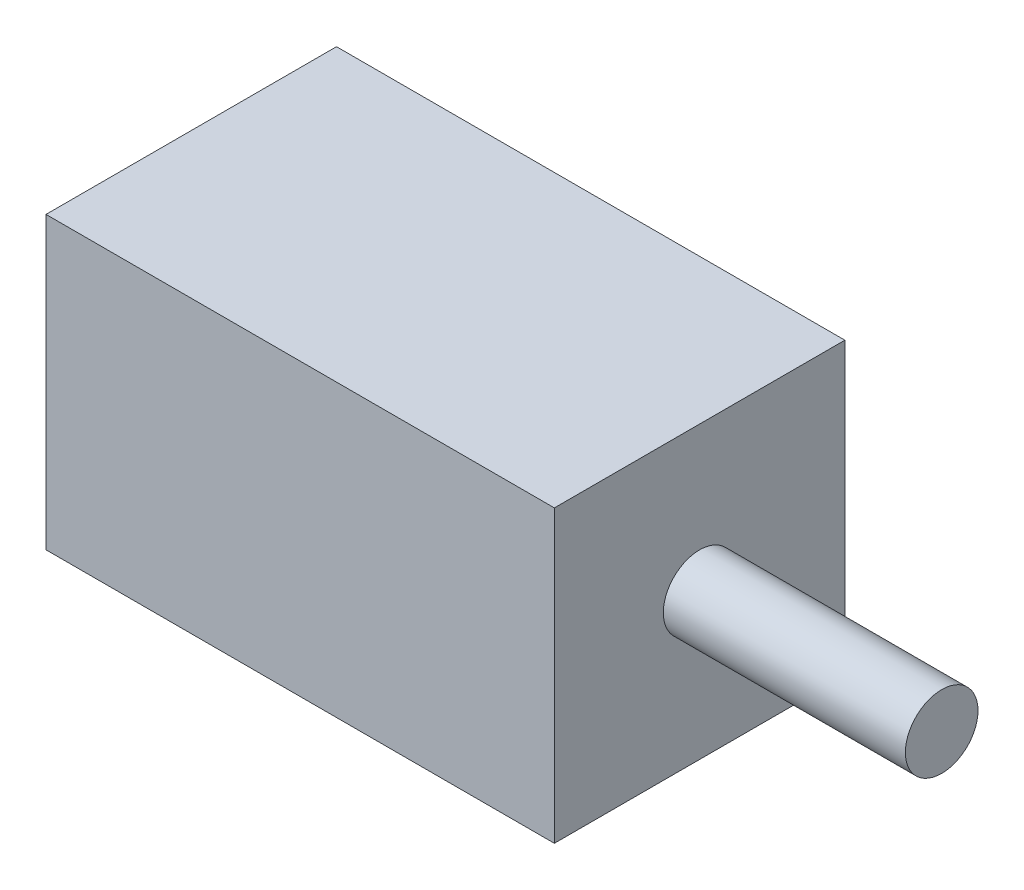
ISO-10303-21;
HEADER;
FILE_DESCRIPTION(('STEP AP214'),'2;1');
FILE_NAME('part.step','',(''),(''),'','','');
FILE_SCHEMA(('AUTOMOTIVE_DESIGN { 1 0 10303 214 1 1 1 1 }'));
ENDSEC;
DATA;
#1=APPLICATION_CONTEXT('core data for automotive mechanical design processes');
#2=APPLICATION_PROTOCOL_DEFINITION('international standard','automotive_design',2000,#1);
#3=PRODUCT_CONTEXT('',#1,'mechanical');
#4=PRODUCT('Part','Part','',(#3));
#5=PRODUCT_RELATED_PRODUCT_CATEGORY('part','',(#4));
#6=PRODUCT_DEFINITION_FORMATION('','',#4);
#7=PRODUCT_DEFINITION_CONTEXT('part definition',#1,'design');
#8=PRODUCT_DEFINITION('design','',#6,#7);
#9=PRODUCT_DEFINITION_SHAPE('','',#8);
#10=(LENGTH_UNIT() NAMED_UNIT(*) SI_UNIT(.MILLI.,.METRE.));
#11=(NAMED_UNIT(*) PLANE_ANGLE_UNIT() SI_UNIT($,.RADIAN.));
#12=(NAMED_UNIT(*) SI_UNIT($,.STERADIAN.) SOLID_ANGLE_UNIT());
#13=UNCERTAINTY_MEASURE_WITH_UNIT(LENGTH_MEASURE(1.E-05),#10,'distance_accuracy_value','');
#14=(GEOMETRIC_REPRESENTATION_CONTEXT(3) GLOBAL_UNCERTAINTY_ASSIGNED_CONTEXT((#13)) GLOBAL_UNIT_ASSIGNED_CONTEXT((#10,
#11,#12)) REPRESENTATION_CONTEXT('',''));
#15=CARTESIAN_POINT('',(0.,0.,0.));
#16=DIRECTION('',(0.,0.,1.));
#17=DIRECTION('',(1.,0.,0.));
#18=AXIS2_PLACEMENT_3D('',#15,#16,#17);
#19=CARTESIAN_POINT('',(6.44318181818183,12.,-5.78693181818181));
#20=DIRECTION('',(-1.,0.,0.));
#21=DIRECTION('',(0.,0.,1.));
#22=AXIS2_PLACEMENT_3D('',#19,#20,#21);
#23=PLANE('',#22);
#24=CARTESIAN_POINT('',(6.44318181818183,6.,0.213068181818188));
#25=DIRECTION('',(-1.,0.,0.));
#26=DIRECTION('',(0.,0.,1.));
#27=AXIS2_PLACEMENT_3D('',#24,#25,#26);
#28=CIRCLE('',#27,1.5);
#29=CARTESIAN_POINT('',(6.44318181818183,6.,1.71306818181819));
#30=VERTEX_POINT('',#29);
#31=EDGE_CURVE('E11',#30,#30,#28,.F.);
#32=ORIENTED_EDGE('',*,*,#31,.F.);
#33=EDGE_LOOP('',(#32));
#34=FACE_BOUND('',#33,.T.);
#35=DIRECTION('',(0.,0.,-1.));
#36=VECTOR('',#35,1.);
#37=CARTESIAN_POINT('',(6.44318181818183,0.,-5.78693181818181));
#38=LINE('',#37,#36);
#39=CARTESIAN_POINT('',(6.44318181818183,0.,6.21306818181819));
#40=VERTEX_POINT('',#39);
#41=CARTESIAN_POINT('',(6.44318181818183,0.,-5.78693181818181));
#42=VERTEX_POINT('',#41);
#43=EDGE_CURVE('E100',#40,#42,#38,.T.);
#44=ORIENTED_EDGE('',*,*,#43,.T.);
#45=DIRECTION('',(0.,-1.,0.));
#46=VECTOR('',#45,1.);
#47=CARTESIAN_POINT('',(6.44318181818183,12.,-5.78693181818181));
#48=LINE('',#47,#46);
#49=CARTESIAN_POINT('',(6.44318181818183,12.,-5.78693181818181));
#50=VERTEX_POINT('',#49);
#51=EDGE_CURVE('E42',#50,#42,#48,.T.);
#52=ORIENTED_EDGE('',*,*,#51,.F.);
#53=DIRECTION('',(0.,0.,-1.));
#54=VECTOR('',#53,1.);
#55=CARTESIAN_POINT('',(6.44318181818183,12.,-5.78693181818181));
#56=LINE('',#55,#54);
#57=CARTESIAN_POINT('',(6.44318181818183,12.,6.21306818181819));
#58=VERTEX_POINT('',#57);
#59=EDGE_CURVE('E86',#58,#50,#56,.T.);
#60=ORIENTED_EDGE('',*,*,#59,.F.);
#61=DIRECTION('',(0.,-1.,0.));
#62=VECTOR('',#61,1.);
#63=CARTESIAN_POINT('',(6.44318181818183,12.,6.21306818181819));
#64=LINE('',#63,#62);
#65=EDGE_CURVE('E96',#58,#40,#64,.T.);
#66=ORIENTED_EDGE('',*,*,#65,.T.);
#67=EDGE_LOOP('',(#44,#52,#60,#66));
#68=FACE_BOUND('',#67,.T.);
#69=ADVANCED_FACE('F34',(#34,#68),#23,.F.);
#70=CARTESIAN_POINT('',(6.44318181818183,12.,-5.78693181818181));
#71=DIRECTION('',(0.,0.,1.));
#72=DIRECTION('',(1.,0.,0.));
#73=AXIS2_PLACEMENT_3D('',#70,#71,#72);
#74=PLANE('',#73);
#75=DIRECTION('',(-1.,0.,0.));
#76=VECTOR('',#75,1.);
#77=CARTESIAN_POINT('',(6.44318181818183,0.,-5.78693181818181));
#78=LINE('',#77,#76);
#79=CARTESIAN_POINT('',(-14.5568181818182,0.,-5.78693181818181));
#80=VERTEX_POINT('',#79);
#81=EDGE_CURVE('E91',#42,#80,#78,.T.);
#82=ORIENTED_EDGE('',*,*,#81,.T.);
#83=DIRECTION('',(0.,-1.,0.));
#84=VECTOR('',#83,1.);
#85=CARTESIAN_POINT('',(-14.5568181818182,12.,-5.78693181818181));
#86=LINE('',#85,#84);
#87=CARTESIAN_POINT('',(-14.5568181818182,12.,-5.78693181818181));
#88=VERTEX_POINT('',#87);
#89=EDGE_CURVE('E89',#88,#80,#86,.T.);
#90=ORIENTED_EDGE('',*,*,#89,.F.);
#91=DIRECTION('',(-1.,0.,0.));
#92=VECTOR('',#91,1.);
#93=CARTESIAN_POINT('',(6.44318181818183,12.,-5.78693181818181));
#94=LINE('',#93,#92);
#95=EDGE_CURVE('E81',#50,#88,#94,.T.);
#96=ORIENTED_EDGE('',*,*,#95,.F.);
#97=ORIENTED_EDGE('',*,*,#51,.T.);
#98=EDGE_LOOP('',(#82,#90,#96,#97));
#99=FACE_BOUND('',#98,.T.);
#100=ADVANCED_FACE('F90',(#99),#74,.F.);
#101=CARTESIAN_POINT('',(-14.5568181818182,12.,-5.78693181818181));
#102=DIRECTION('',(1.,0.,0.));
#103=DIRECTION('',(0.,0.,-1.));
#104=AXIS2_PLACEMENT_3D('',#101,#102,#103);
#105=PLANE('',#104);
#106=DIRECTION('',(0.,0.,1.));
#107=VECTOR('',#106,1.);
#108=CARTESIAN_POINT('',(-14.5568181818182,0.,-5.78693181818181));
#109=LINE('',#108,#107);
#110=CARTESIAN_POINT('',(-14.5568181818182,0.,6.21306818181819));
#111=VERTEX_POINT('',#110);
#112=EDGE_CURVE('E67',#80,#111,#109,.T.);
#113=ORIENTED_EDGE('',*,*,#112,.T.);
#114=DIRECTION('',(0.,-1.,0.));
#115=VECTOR('',#114,1.);
#116=CARTESIAN_POINT('',(-14.5568181818182,12.,6.21306818181819));
#117=LINE('',#116,#115);
#118=CARTESIAN_POINT('',(-14.5568181818182,12.,6.21306818181819));
#119=VERTEX_POINT('',#118);
#120=EDGE_CURVE('E92',#119,#111,#117,.T.);
#121=ORIENTED_EDGE('',*,*,#120,.F.);
#122=DIRECTION('',(0.,0.,1.));
#123=VECTOR('',#122,1.);
#124=CARTESIAN_POINT('',(-14.5568181818182,12.,-5.78693181818181));
#125=LINE('',#124,#123);
#126=EDGE_CURVE('E84',#88,#119,#125,.T.);
#127=ORIENTED_EDGE('',*,*,#126,.F.);
#128=ORIENTED_EDGE('',*,*,#89,.T.);
#129=EDGE_LOOP('',(#113,#121,#127,#128));
#130=FACE_BOUND('',#129,.T.);
#131=ADVANCED_FACE('F94',(#130),#105,.F.);
#132=CARTESIAN_POINT('',(6.44318181818183,12.,6.21306818181819));
#133=DIRECTION('',(0.,0.,-1.));
#134=DIRECTION('',(-1.,0.,0.));
#135=AXIS2_PLACEMENT_3D('',#132,#133,#134);
#136=PLANE('',#135);
#137=DIRECTION('',(1.,0.,0.));
#138=VECTOR('',#137,1.);
#139=CARTESIAN_POINT('',(6.44318181818183,0.,6.21306818181819));
#140=LINE('',#139,#138);
#141=EDGE_CURVE('E73',#111,#40,#140,.T.);
#142=ORIENTED_EDGE('',*,*,#141,.T.);
#143=ORIENTED_EDGE('',*,*,#65,.F.);
#144=DIRECTION('',(1.,0.,0.));
#145=VECTOR('',#144,1.);
#146=CARTESIAN_POINT('',(6.44318181818183,12.,6.21306818181819));
#147=LINE('',#146,#145);
#148=EDGE_CURVE('E50',#119,#58,#147,.T.);
#149=ORIENTED_EDGE('',*,*,#148,.F.);
#150=ORIENTED_EDGE('',*,*,#120,.T.);
#151=EDGE_LOOP('',(#142,#143,#149,#150));
#152=FACE_BOUND('',#151,.T.);
#153=ADVANCED_FACE('F122',(#152),#136,.F.);
#154=CARTESIAN_POINT('',(0.,12.,0.));
#155=DIRECTION('',(0.,-1.,0.));
#156=DIRECTION('',(0.,0.,-1.));
#157=AXIS2_PLACEMENT_3D('',#154,#155,#156);
#158=PLANE('',#157);
#159=ORIENTED_EDGE('',*,*,#59,.T.);
#160=ORIENTED_EDGE('',*,*,#95,.T.);
#161=ORIENTED_EDGE('',*,*,#126,.T.);
#162=ORIENTED_EDGE('',*,*,#148,.T.);
#163=EDGE_LOOP('',(#159,#160,#161,#162));
#164=FACE_BOUND('',#163,.T.);
#165=ADVANCED_FACE('F82',(#164),#158,.F.);
#166=CARTESIAN_POINT('',(0.,0.,0.));
#167=DIRECTION('',(0.,-1.,0.));
#168=DIRECTION('',(0.,0.,-1.));
#169=AXIS2_PLACEMENT_3D('',#166,#167,#168);
#170=PLANE('',#169);
#171=ORIENTED_EDGE('',*,*,#43,.F.);
#172=ORIENTED_EDGE('',*,*,#141,.F.);
#173=ORIENTED_EDGE('',*,*,#112,.F.);
#174=ORIENTED_EDGE('',*,*,#81,.F.);
#175=EDGE_LOOP('',(#171,#172,#173,#174));
#176=FACE_BOUND('',#175,.T.);
#177=ADVANCED_FACE('F111',(#176),#170,.T.);
#178=CARTESIAN_POINT('',(16.4431818181818,6.,0.213068181818187));
#179=DIRECTION('',(-1.,0.,0.));
#180=DIRECTION('',(0.,0.,1.));
#181=AXIS2_PLACEMENT_3D('',#178,#179,#180);
#182=CYLINDRICAL_SURFACE('',#181,1.5);
#183=CARTESIAN_POINT('',(16.4431818181818,6.,0.213068181818187));
#184=DIRECTION('',(1.,0.,0.));
#185=DIRECTION('',(0.,0.,-1.));
#186=AXIS2_PLACEMENT_3D('',#183,#184,#185);
#187=CIRCLE('',#186,1.5);
#188=CARTESIAN_POINT('',(16.4431818181818,6.,-1.28693181818181));
#189=VERTEX_POINT('',#188);
#190=EDGE_CURVE('E103',#189,#189,#187,.T.);
#191=ORIENTED_EDGE('',*,*,#190,.F.);
#192=EDGE_LOOP('',(#191));
#193=FACE_BOUND('',#192,.T.);
#194=ORIENTED_EDGE('',*,*,#31,.T.);
#195=EDGE_LOOP('',(#194));
#196=FACE_BOUND('',#195,.T.);
#197=ADVANCED_FACE('F113',(#193,#196),#182,.T.);
#198=CARTESIAN_POINT('',(16.4431818181818,0.,0.));
#199=DIRECTION('',(1.,0.,0.));
#200=DIRECTION('',(0.,0.,-1.));
#201=AXIS2_PLACEMENT_3D('',#198,#199,#200);
#202=PLANE('',#201);
#203=ORIENTED_EDGE('',*,*,#190,.T.);
#204=EDGE_LOOP('',(#203));
#205=FACE_BOUND('',#204,.T.);
#206=ADVANCED_FACE('F119',(#205),#202,.T.);
#207=CLOSED_SHELL('',(#69,#100,#131,#153,#165,#177,#197,#206));
#208=MANIFOLD_SOLID_BREP('B2',#207);
#209=ADVANCED_BREP_SHAPE_REPRESENTATION('',(#18,#208),#14);
#210=SHAPE_DEFINITION_REPRESENTATION(#9,#209);
ENDSEC;
END-ISO-10303-21;
